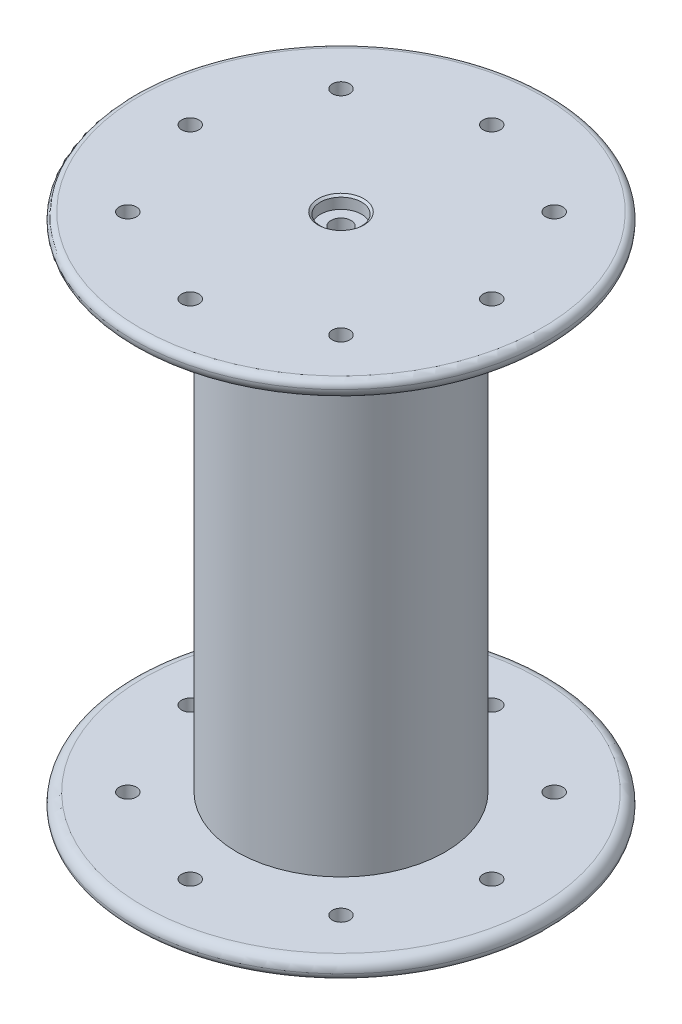
ISO-10303-21;
HEADER;
FILE_DESCRIPTION(('STEP AP214'),'2;1');
FILE_NAME('part.step','',(''),(''),'','','');
FILE_SCHEMA(('AUTOMOTIVE_DESIGN { 1 0 10303 214 1 1 1 1 }'));
ENDSEC;
DATA;
#1=APPLICATION_CONTEXT('core data for automotive mechanical design processes');
#2=APPLICATION_PROTOCOL_DEFINITION('international standard','automotive_design',2000,#1);
#3=PRODUCT_CONTEXT('',#1,'mechanical');
#4=PRODUCT('Part','Part','',(#3));
#5=PRODUCT_RELATED_PRODUCT_CATEGORY('part','',(#4));
#6=PRODUCT_DEFINITION_FORMATION('','',#4);
#7=PRODUCT_DEFINITION_CONTEXT('part definition',#1,'design');
#8=PRODUCT_DEFINITION('design','',#6,#7);
#9=PRODUCT_DEFINITION_SHAPE('','',#8);
#10=(LENGTH_UNIT() NAMED_UNIT(*) SI_UNIT(.MILLI.,.METRE.));
#11=(NAMED_UNIT(*) PLANE_ANGLE_UNIT() SI_UNIT($,.RADIAN.));
#12=(NAMED_UNIT(*) SI_UNIT($,.STERADIAN.) SOLID_ANGLE_UNIT());
#13=UNCERTAINTY_MEASURE_WITH_UNIT(LENGTH_MEASURE(1.E-05),#10,'distance_accuracy_value','');
#14=(GEOMETRIC_REPRESENTATION_CONTEXT(3) GLOBAL_UNCERTAINTY_ASSIGNED_CONTEXT((#13)) GLOBAL_UNIT_ASSIGNED_CONTEXT((#10,
#11,#12)) REPRESENTATION_CONTEXT('',''));
#15=CARTESIAN_POINT('',(0.,0.,0.));
#16=DIRECTION('',(0.,0.,1.));
#17=DIRECTION('',(1.,0.,0.));
#18=AXIS2_PLACEMENT_3D('',#15,#16,#17);
#19=CARTESIAN_POINT('',(0.,70.,0.));
#20=DIRECTION('',(0.,-1.,0.));
#21=DIRECTION('',(0.,0.,-1.));
#22=AXIS2_PLACEMENT_3D('',#19,#20,#21);
#23=CYLINDRICAL_SURFACE('',#22,30.);
#24=CARTESIAN_POINT('',(0.,70.,0.));
#25=DIRECTION('',(0.,1.,0.));
#26=DIRECTION('',(0.,0.,1.));
#27=AXIS2_PLACEMENT_3D('',#24,#25,#26);
#28=CIRCLE('',#27,30.);
#29=CARTESIAN_POINT('',(0.,70.,30.));
#30=VERTEX_POINT('',#29);
#31=EDGE_CURVE('E104',#30,#30,#28,.T.);
#32=ORIENTED_EDGE('',*,*,#31,.F.);
#33=EDGE_LOOP('',(#32));
#34=FACE_BOUND('',#33,.T.);
#35=CARTESIAN_POINT('',(0.,-70.,0.));
#36=DIRECTION('',(0.,1.,0.));
#37=DIRECTION('',(0.,0.,1.));
#38=AXIS2_PLACEMENT_3D('',#35,#36,#37);
#39=CIRCLE('',#38,30.);
#40=CARTESIAN_POINT('',(0.,-70.,30.));
#41=VERTEX_POINT('',#40);
#42=EDGE_CURVE('E105',#41,#41,#39,.T.);
#43=ORIENTED_EDGE('',*,*,#42,.T.);
#44=EDGE_LOOP('',(#43));
#45=FACE_BOUND('',#44,.T.);
#46=ADVANCED_FACE('F37',(#34,#45),#23,.T.);
#47=CARTESIAN_POINT('',(0.,75.,0.));
#48=DIRECTION('',(0.,1.,0.));
#49=DIRECTION('',(0.,0.,1.));
#50=AXIS2_PLACEMENT_3D('',#47,#48,#49);
#51=PLANE('',#50);
#52=CARTESIAN_POINT('',(43.5,75.,1.51879438239676E-13));
#53=DIRECTION('',(0.,1.,0.));
#54=DIRECTION('',(-1.,0.,0.));
#55=AXIS2_PLACEMENT_3D('',#52,#53,#54);
#56=CIRCLE('',#55,2.5);
#57=CARTESIAN_POINT('',(41.,75.,1.43150734892568E-13));
#58=VERTEX_POINT('',#57);
#59=EDGE_CURVE('E135',#58,#58,#56,.T.);
#60=ORIENTED_EDGE('',*,*,#59,.F.);
#61=EDGE_LOOP('',(#60));
#62=FACE_BOUND('',#61,.T.);
#63=CARTESIAN_POINT('',(30.7591449816147,75.,30.759144981615));
#64=DIRECTION('',(0.,1.,0.));
#65=DIRECTION('',(-0.707106781186544,0.,-0.707106781186551));
#66=AXIS2_PLACEMENT_3D('',#63,#64,#65);
#67=CIRCLE('',#66,2.5);
#68=CARTESIAN_POINT('',(28.9913780286483,75.,28.9913780286486));
#69=VERTEX_POINT('',#68);
#70=EDGE_CURVE('E145',#69,#69,#67,.T.);
#71=ORIENTED_EDGE('',*,*,#70,.F.);
#72=EDGE_LOOP('',(#71));
#73=FACE_BOUND('',#72,.T.);
#74=CARTESIAN_POINT('',(0.,75.,43.5));
#75=DIRECTION('',(0.,1.,0.));
#76=DIRECTION('',(0.,0.,-1.));
#77=AXIS2_PLACEMENT_3D('',#74,#75,#76);
#78=CIRCLE('',#77,2.5);
#79=CARTESIAN_POINT('',(0.,75.,41.));
#80=VERTEX_POINT('',#79);
#81=EDGE_CURVE('E140',#80,#80,#78,.T.);
#82=ORIENTED_EDGE('',*,*,#81,.F.);
#83=EDGE_LOOP('',(#82));
#84=FACE_BOUND('',#83,.T.);
#85=CARTESIAN_POINT('',(-30.7591449816151,75.,30.7591449816145));
#86=DIRECTION('',(0.,1.,0.));
#87=DIRECTION('',(0.707106781186554,0.,-0.707106781186541));
#88=AXIS2_PLACEMENT_3D('',#85,#86,#87);
#89=CIRCLE('',#88,2.5);
#90=CARTESIAN_POINT('',(-28.9913780286487,75.,28.9913780286482));
#91=VERTEX_POINT('',#90);
#92=EDGE_CURVE('E136',#91,#91,#89,.T.);
#93=ORIENTED_EDGE('',*,*,#92,.F.);
#94=EDGE_LOOP('',(#93));
#95=FACE_BOUND('',#94,.T.);
#96=CARTESIAN_POINT('',(-43.5,75.,-4.55638314719029E-13));
#97=DIRECTION('',(0.,1.,0.));
#98=DIRECTION('',(1.,0.,0.));
#99=AXIS2_PLACEMENT_3D('',#96,#97,#98);
#100=CIRCLE('',#99,2.5);
#101=CARTESIAN_POINT('',(-41.,75.,-4.29452204677705E-13));
#102=VERTEX_POINT('',#101);
#103=EDGE_CURVE('E141',#102,#102,#100,.T.);
#104=ORIENTED_EDGE('',*,*,#103,.F.);
#105=EDGE_LOOP('',(#104));
#106=FACE_BOUND('',#105,.T.);
#107=CARTESIAN_POINT('',(-30.7591449816144,75.,-30.7591449816152));
#108=DIRECTION('',(0.,1.,0.));
#109=DIRECTION('',(0.707106781186539,0.,0.707106781186556));
#110=AXIS2_PLACEMENT_3D('',#107,#108,#109);
#111=CIRCLE('',#110,2.5);
#112=CARTESIAN_POINT('',(-28.9913780286481,75.,-28.9913780286488));
#113=VERTEX_POINT('',#112);
#114=EDGE_CURVE('E109',#113,#113,#111,.T.);
#115=ORIENTED_EDGE('',*,*,#114,.F.);
#116=EDGE_LOOP('',(#115));
#117=FACE_BOUND('',#116,.T.);
#118=CARTESIAN_POINT('',(30.7591449816149,75.,-30.7591449816148));
#119=DIRECTION('',(0.,1.,0.));
#120=DIRECTION('',(-0.707106781186549,0.,0.707106781186546));
#121=AXIS2_PLACEMENT_3D('',#118,#119,#120);
#122=CIRCLE('',#121,2.5);
#123=CARTESIAN_POINT('',(28.9913780286485,75.,-28.9913780286484));
#124=VERTEX_POINT('',#123);
#125=EDGE_CURVE('E87',#124,#124,#122,.T.);
#126=ORIENTED_EDGE('',*,*,#125,.F.);
#127=EDGE_LOOP('',(#126));
#128=FACE_BOUND('',#127,.T.);
#129=CARTESIAN_POINT('',(0.,75.,-43.5));
#130=DIRECTION('',(0.,1.,0.));
#131=DIRECTION('',(0.,0.,1.));
#132=AXIS2_PLACEMENT_3D('',#129,#130,#131);
#133=CIRCLE('',#132,2.5);
#134=CARTESIAN_POINT('',(0.,75.,-41.));
#135=VERTEX_POINT('',#134);
#136=EDGE_CURVE('E62',#135,#135,#133,.T.);
#137=ORIENTED_EDGE('',*,*,#136,.F.);
#138=EDGE_LOOP('',(#137));
#139=FACE_BOUND('',#138,.T.);
#140=CARTESIAN_POINT('',(0.,75.,0.));
#141=DIRECTION('',(0.,1.,0.));
#142=DIRECTION('',(0.,0.,1.));
#143=AXIS2_PLACEMENT_3D('',#140,#141,#142);
#144=CIRCLE('',#143,6.58876);
#145=CARTESIAN_POINT('',(0.,75.,6.58876));
#146=VERTEX_POINT('',#145);
#147=EDGE_CURVE('E92',#146,#146,#144,.T.);
#148=ORIENTED_EDGE('',*,*,#147,.F.);
#149=EDGE_LOOP('',(#148));
#150=FACE_BOUND('',#149,.T.);
#151=CARTESIAN_POINT('',(0.,75.,0.));
#152=DIRECTION('',(0.,1.,0.));
#153=DIRECTION('',(0.,0.,1.));
#154=AXIS2_PLACEMENT_3D('',#151,#152,#153);
#155=CIRCLE('',#154,58.);
#156=CARTESIAN_POINT('',(0.,75.,58.));
#157=VERTEX_POINT('',#156);
#158=EDGE_CURVE('E100',#157,#157,#155,.T.);
#159=ORIENTED_EDGE('',*,*,#158,.T.);
#160=EDGE_LOOP('',(#159));
#161=FACE_BOUND('',#160,.T.);
#162=ADVANCED_FACE('F270',(#62,#73,#84,#95,#106,#117,#128,#139,#150,#161),#51,.T.);
#163=CARTESIAN_POINT('',(0.,70.,0.));
#164=DIRECTION('',(0.,1.,0.));
#165=DIRECTION('',(0.,0.,1.));
#166=AXIS2_PLACEMENT_3D('',#163,#164,#165);
#167=PLANE('',#166);
#168=CARTESIAN_POINT('',(43.5,70.,1.51879438239676E-13));
#169=DIRECTION('',(0.,1.,0.));
#170=DIRECTION('',(0.,0.,1.));
#171=AXIS2_PLACEMENT_3D('',#168,#169,#170);
#172=CIRCLE('',#171,2.5);
#173=CARTESIAN_POINT('',(43.5,70.,2.50000000000015));
#174=VERTEX_POINT('',#173);
#175=EDGE_CURVE('E58',#174,#174,#172,.T.);
#176=ORIENTED_EDGE('',*,*,#175,.T.);
#177=EDGE_LOOP('',(#176));
#178=FACE_BOUND('',#177,.T.);
#179=CARTESIAN_POINT('',(30.7591449816147,70.,30.759144981615));
#180=DIRECTION('',(0.,1.,0.));
#181=DIRECTION('',(0.,0.,1.));
#182=AXIS2_PLACEMENT_3D('',#179,#180,#181);
#183=CIRCLE('',#182,2.5);
#184=CARTESIAN_POINT('',(30.7591449816147,70.,33.259144981615));
#185=VERTEX_POINT('',#184);
#186=EDGE_CURVE('E63',#185,#185,#183,.T.);
#187=ORIENTED_EDGE('',*,*,#186,.T.);
#188=EDGE_LOOP('',(#187));
#189=FACE_BOUND('',#188,.T.);
#190=CARTESIAN_POINT('',(0.,70.,43.5));
#191=DIRECTION('',(0.,1.,0.));
#192=DIRECTION('',(0.,0.,1.));
#193=AXIS2_PLACEMENT_3D('',#190,#191,#192);
#194=CIRCLE('',#193,2.5);
#195=CARTESIAN_POINT('',(0.,70.,46.));
#196=VERTEX_POINT('',#195);
#197=EDGE_CURVE('E67',#196,#196,#194,.T.);
#198=ORIENTED_EDGE('',*,*,#197,.T.);
#199=EDGE_LOOP('',(#198));
#200=FACE_BOUND('',#199,.T.);
#201=CARTESIAN_POINT('',(-30.7591449816151,70.,30.7591449816145));
#202=DIRECTION('',(0.,1.,0.));
#203=DIRECTION('',(0.,0.,1.));
#204=AXIS2_PLACEMENT_3D('',#201,#202,#203);
#205=CIRCLE('',#204,2.5);
#206=CARTESIAN_POINT('',(-30.7591449816151,70.,33.2591449816145));
#207=VERTEX_POINT('',#206);
#208=EDGE_CURVE('E71',#207,#207,#205,.T.);
#209=ORIENTED_EDGE('',*,*,#208,.T.);
#210=EDGE_LOOP('',(#209));
#211=FACE_BOUND('',#210,.T.);
#212=CARTESIAN_POINT('',(-43.5,70.,-4.55638314719029E-13));
#213=DIRECTION('',(0.,1.,0.));
#214=DIRECTION('',(0.,0.,1.));
#215=AXIS2_PLACEMENT_3D('',#212,#213,#214);
#216=CIRCLE('',#215,2.5);
#217=CARTESIAN_POINT('',(-43.5,70.,2.49999999999955));
#218=VERTEX_POINT('',#217);
#219=EDGE_CURVE('E75',#218,#218,#216,.T.);
#220=ORIENTED_EDGE('',*,*,#219,.T.);
#221=EDGE_LOOP('',(#220));
#222=FACE_BOUND('',#221,.T.);
#223=CARTESIAN_POINT('',(-30.7591449816144,70.,-30.7591449816152));
#224=DIRECTION('',(0.,1.,0.));
#225=DIRECTION('',(0.,0.,1.));
#226=AXIS2_PLACEMENT_3D('',#223,#224,#225);
#227=CIRCLE('',#226,2.5);
#228=CARTESIAN_POINT('',(-30.7591449816144,70.,-28.2591449816152));
#229=VERTEX_POINT('',#228);
#230=EDGE_CURVE('E79',#229,#229,#227,.T.);
#231=ORIENTED_EDGE('',*,*,#230,.T.);
#232=EDGE_LOOP('',(#231));
#233=FACE_BOUND('',#232,.T.);
#234=CARTESIAN_POINT('',(30.7591449816149,70.,-30.7591449816148));
#235=DIRECTION('',(0.,1.,0.));
#236=DIRECTION('',(0.,0.,1.));
#237=AXIS2_PLACEMENT_3D('',#234,#235,#236);
#238=CIRCLE('',#237,2.5);
#239=CARTESIAN_POINT('',(30.7591449816149,70.,-28.2591449816148));
#240=VERTEX_POINT('',#239);
#241=EDGE_CURVE('E83',#240,#240,#238,.T.);
#242=ORIENTED_EDGE('',*,*,#241,.T.);
#243=EDGE_LOOP('',(#242));
#244=FACE_BOUND('',#243,.T.);
#245=CARTESIAN_POINT('',(0.,70.,-43.5));
#246=DIRECTION('',(0.,1.,0.));
#247=DIRECTION('',(0.,0.,1.));
#248=AXIS2_PLACEMENT_3D('',#245,#246,#247);
#249=CIRCLE('',#248,2.5);
#250=CARTESIAN_POINT('',(0.,70.,-41.));
#251=VERTEX_POINT('',#250);
#252=EDGE_CURVE('E88',#251,#251,#249,.T.);
#253=ORIENTED_EDGE('',*,*,#252,.T.);
#254=EDGE_LOOP('',(#253));
#255=FACE_BOUND('',#254,.T.);
#256=CARTESIAN_POINT('',(0.,70.,0.));
#257=DIRECTION('',(0.,1.,0.));
#258=DIRECTION('',(0.,0.,1.));
#259=AXIS2_PLACEMENT_3D('',#256,#257,#258);
#260=CIRCLE('',#259,57.);
#261=CARTESIAN_POINT('',(0.,70.,57.));
#262=VERTEX_POINT('',#261);
#263=EDGE_CURVE('E55',#262,#262,#260,.F.);
#264=ORIENTED_EDGE('',*,*,#263,.T.);
#265=EDGE_LOOP('',(#264));
#266=FACE_BOUND('',#265,.T.);
#267=ORIENTED_EDGE('',*,*,#31,.T.);
#268=EDGE_LOOP('',(#267));
#269=FACE_BOUND('',#268,.T.);
#270=ADVANCED_FACE('F276',(#178,#189,#200,#211,#222,#233,#244,#255,#266,#269),#167,.F.);
#271=CARTESIAN_POINT('',(0.,73.,0.));
#272=DIRECTION('',(0.,1.,0.));
#273=DIRECTION('',(0.,0.,1.));
#274=AXIS2_PLACEMENT_3D('',#271,#272,#273);
#275=TOROIDAL_SURFACE('',#274,58.,2.);
#276=CARTESIAN_POINT('',(0.,73.,0.));
#277=DIRECTION('',(0.,1.,0.));
#278=DIRECTION('',(0.,0.,1.));
#279=AXIS2_PLACEMENT_3D('',#276,#277,#278);
#280=CIRCLE('',#279,60.);
#281=CARTESIAN_POINT('',(0.,73.,60.));
#282=VERTEX_POINT('',#281);
#283=EDGE_CURVE('E96',#282,#282,#280,.F.);
#284=ORIENTED_EDGE('',*,*,#283,.F.);
#285=EDGE_LOOP('',(#284));
#286=FACE_BOUND('',#285,.T.);
#287=ORIENTED_EDGE('',*,*,#158,.F.);
#288=EDGE_LOOP('',(#287));
#289=FACE_BOUND('',#288,.T.);
#290=ADVANCED_FACE('F282',(#286,#289),#275,.T.);
#291=CARTESIAN_POINT('',(0.,73.,0.));
#292=DIRECTION('',(0.,1.,0.));
#293=DIRECTION('',(0.,0.,1.));
#294=AXIS2_PLACEMENT_3D('',#291,#292,#293);
#295=TOROIDAL_SURFACE('',#294,57.,3.);
#296=ORIENTED_EDGE('',*,*,#263,.F.);
#297=EDGE_LOOP('',(#296));
#298=FACE_BOUND('',#297,.T.);
#299=ORIENTED_EDGE('',*,*,#283,.T.);
#300=EDGE_LOOP('',(#299));
#301=FACE_BOUND('',#300,.T.);
#302=ADVANCED_FACE('F285',(#298,#301),#295,.T.);
#303=CARTESIAN_POINT('',(0.,75.,0.));
#304=DIRECTION('',(0.,1.,0.));
#305=DIRECTION('',(0.,0.,1.));
#306=AXIS2_PLACEMENT_3D('',#303,#304,#305);
#307=CYLINDRICAL_SURFACE('',#306,2.89559999999998);
#308=CARTESIAN_POINT('',(0.,71.4186,0.));
#309=DIRECTION('',(0.,1.,0.));
#310=DIRECTION('',(0.,0.,1.));
#311=AXIS2_PLACEMENT_3D('',#308,#309,#310);
#312=CIRCLE('',#311,2.8956);
#313=CARTESIAN_POINT('',(0.,71.4186,2.8956));
#314=VERTEX_POINT('',#313);
#315=EDGE_CURVE('E114',#314,#314,#312,.T.);
#316=ORIENTED_EDGE('',*,*,#315,.T.);
#317=EDGE_LOOP('',(#316));
#318=FACE_BOUND('',#317,.T.);
#319=CARTESIAN_POINT('',(0.,-71.4186,0.));
#320=DIRECTION('',(0.,-1.,0.));
#321=DIRECTION('',(0.,0.,-1.));
#322=AXIS2_PLACEMENT_3D('',#319,#320,#321);
#323=CIRCLE('',#322,2.8956);
#324=CARTESIAN_POINT('',(0.,-71.4186,-2.8956));
#325=VERTEX_POINT('',#324);
#326=EDGE_CURVE('E110',#325,#325,#323,.T.);
#327=ORIENTED_EDGE('',*,*,#326,.T.);
#328=EDGE_LOOP('',(#327));
#329=FACE_BOUND('',#328,.T.);
#330=ADVANCED_FACE('F288',(#318,#329),#307,.F.);
#331=CARTESIAN_POINT('',(5.95376,71.4186,0.));
#332=DIRECTION('',(0.,-1.,0.));
#333=DIRECTION('',(0.,0.,-1.));
#334=AXIS2_PLACEMENT_3D('',#331,#332,#333);
#335=PLANE('',#334);
#336=ORIENTED_EDGE('',*,*,#315,.F.);
#337=EDGE_LOOP('',(#336));
#338=FACE_BOUND('',#337,.T.);
#339=CARTESIAN_POINT('',(0.,71.4186,0.));
#340=DIRECTION('',(0.,1.,0.));
#341=DIRECTION('',(0.,0.,1.));
#342=AXIS2_PLACEMENT_3D('',#339,#340,#341);
#343=CIRCLE('',#342,5.95376);
#344=CARTESIAN_POINT('',(0.,71.4186,5.95376));
#345=VERTEX_POINT('',#344);
#346=EDGE_CURVE('E118',#345,#345,#343,.T.);
#347=ORIENTED_EDGE('',*,*,#346,.T.);
#348=EDGE_LOOP('',(#347));
#349=FACE_BOUND('',#348,.T.);
#350=ADVANCED_FACE('F346',(#338,#349),#335,.F.);
#351=CARTESIAN_POINT('',(0.,75.,0.));
#352=DIRECTION('',(0.,1.,0.));
#353=DIRECTION('',(0.,0.,1.));
#354=AXIS2_PLACEMENT_3D('',#351,#352,#353);
#355=CYLINDRICAL_SURFACE('',#354,5.95376);
#356=ORIENTED_EDGE('',*,*,#346,.F.);
#357=EDGE_LOOP('',(#356));
#358=FACE_BOUND('',#357,.T.);
#359=CARTESIAN_POINT('',(0.,74.4671717342024,0.));
#360=DIRECTION('',(0.,1.,0.));
#361=DIRECTION('',(0.,0.,1.));
#362=AXIS2_PLACEMENT_3D('',#359,#360,#361);
#363=CIRCLE('',#362,5.95376);
#364=CARTESIAN_POINT('',(0.,74.4671717342024,5.95376));
#365=VERTEX_POINT('',#364);
#366=EDGE_CURVE('E122',#365,#365,#363,.T.);
#367=ORIENTED_EDGE('',*,*,#366,.T.);
#368=EDGE_LOOP('',(#367));
#369=FACE_BOUND('',#368,.T.);
#370=ADVANCED_FACE('F342',(#358,#369),#355,.F.);
#371=CARTESIAN_POINT('',(0.,75.,0.));
#372=DIRECTION('',(0.,1.,0.));
#373=DIRECTION('',(0.,0.,1.));
#374=AXIS2_PLACEMENT_3D('',#371,#372,#373);
#375=CONICAL_SURFACE('',#374,6.58876,0.872664625997161);
#376=ORIENTED_EDGE('',*,*,#366,.F.);
#377=EDGE_LOOP('',(#376));
#378=FACE_BOUND('',#377,.T.);
#379=ORIENTED_EDGE('',*,*,#147,.T.);
#380=EDGE_LOOP('',(#379));
#381=FACE_BOUND('',#380,.T.);
#382=ADVANCED_FACE('F338',(#378,#381),#375,.F.);
#383=CARTESIAN_POINT('',(0.,-70.,-43.5));
#384=DIRECTION('',(0.,1.,0.));
#385=DIRECTION('',(0.,0.,1.));
#386=AXIS2_PLACEMENT_3D('',#383,#384,#385);
#387=CYLINDRICAL_SURFACE('',#386,2.5);
#388=ORIENTED_EDGE('',*,*,#136,.T.);
#389=EDGE_LOOP('',(#388));
#390=FACE_BOUND('',#389,.T.);
#391=ORIENTED_EDGE('',*,*,#252,.F.);
#392=EDGE_LOOP('',(#391));
#393=FACE_BOUND('',#392,.T.);
#394=ADVANCED_FACE('F334',(#390,#393),#387,.F.);
#395=CARTESIAN_POINT('',(30.7591449816149,-70.,-30.7591449816148));
#396=DIRECTION('',(0.,1.,0.));
#397=DIRECTION('',(0.,0.,1.));
#398=AXIS2_PLACEMENT_3D('',#395,#396,#397);
#399=CYLINDRICAL_SURFACE('',#398,2.5);
#400=ORIENTED_EDGE('',*,*,#125,.T.);
#401=EDGE_LOOP('',(#400));
#402=FACE_BOUND('',#401,.T.);
#403=ORIENTED_EDGE('',*,*,#241,.F.);
#404=EDGE_LOOP('',(#403));
#405=FACE_BOUND('',#404,.T.);
#406=ADVANCED_FACE('F316',(#402,#405),#399,.F.);
#407=CARTESIAN_POINT('',(-30.7591449816144,-70.,-30.7591449816152));
#408=DIRECTION('',(0.,1.,0.));
#409=DIRECTION('',(0.,0.,1.));
#410=AXIS2_PLACEMENT_3D('',#407,#408,#409);
#411=CYLINDRICAL_SURFACE('',#410,2.5);
#412=ORIENTED_EDGE('',*,*,#114,.T.);
#413=EDGE_LOOP('',(#412));
#414=FACE_BOUND('',#413,.T.);
#415=ORIENTED_EDGE('',*,*,#230,.F.);
#416=EDGE_LOOP('',(#415));
#417=FACE_BOUND('',#416,.T.);
#418=ADVANCED_FACE('F312',(#414,#417),#411,.F.);
#419=CARTESIAN_POINT('',(-43.5,-70.,-4.55638314719029E-13));
#420=DIRECTION('',(0.,1.,0.));
#421=DIRECTION('',(0.,0.,1.));
#422=AXIS2_PLACEMENT_3D('',#419,#420,#421);
#423=CYLINDRICAL_SURFACE('',#422,2.5);
#424=ORIENTED_EDGE('',*,*,#103,.T.);
#425=EDGE_LOOP('',(#424));
#426=FACE_BOUND('',#425,.T.);
#427=ORIENTED_EDGE('',*,*,#219,.F.);
#428=EDGE_LOOP('',(#427));
#429=FACE_BOUND('',#428,.T.);
#430=ADVANCED_FACE('F308',(#426,#429),#423,.F.);
#431=CARTESIAN_POINT('',(-30.7591449816151,-70.,30.7591449816145));
#432=DIRECTION('',(0.,1.,0.));
#433=DIRECTION('',(0.,0.,1.));
#434=AXIS2_PLACEMENT_3D('',#431,#432,#433);
#435=CYLINDRICAL_SURFACE('',#434,2.5);
#436=ORIENTED_EDGE('',*,*,#92,.T.);
#437=EDGE_LOOP('',(#436));
#438=FACE_BOUND('',#437,.T.);
#439=ORIENTED_EDGE('',*,*,#208,.F.);
#440=EDGE_LOOP('',(#439));
#441=FACE_BOUND('',#440,.T.);
#442=ADVANCED_FACE('F311',(#438,#441),#435,.F.);
#443=CARTESIAN_POINT('',(0.,-70.,43.5));
#444=DIRECTION('',(0.,1.,0.));
#445=DIRECTION('',(0.,0.,1.));
#446=AXIS2_PLACEMENT_3D('',#443,#444,#445);
#447=CYLINDRICAL_SURFACE('',#446,2.5);
#448=ORIENTED_EDGE('',*,*,#81,.T.);
#449=EDGE_LOOP('',(#448));
#450=FACE_BOUND('',#449,.T.);
#451=ORIENTED_EDGE('',*,*,#197,.F.);
#452=EDGE_LOOP('',(#451));
#453=FACE_BOUND('',#452,.T.);
#454=ADVANCED_FACE('F324',(#450,#453),#447,.F.);
#455=CARTESIAN_POINT('',(30.7591449816147,-70.,30.759144981615));
#456=DIRECTION('',(0.,1.,0.));
#457=DIRECTION('',(0.,0.,1.));
#458=AXIS2_PLACEMENT_3D('',#455,#456,#457);
#459=CYLINDRICAL_SURFACE('',#458,2.5);
#460=ORIENTED_EDGE('',*,*,#70,.T.);
#461=EDGE_LOOP('',(#460));
#462=FACE_BOUND('',#461,.T.);
#463=ORIENTED_EDGE('',*,*,#186,.F.);
#464=EDGE_LOOP('',(#463));
#465=FACE_BOUND('',#464,.T.);
#466=ADVANCED_FACE('F320',(#462,#465),#459,.F.);
#467=CARTESIAN_POINT('',(43.5,-70.,1.51879438239676E-13));
#468=DIRECTION('',(0.,1.,0.));
#469=DIRECTION('',(0.,0.,1.));
#470=AXIS2_PLACEMENT_3D('',#467,#468,#469);
#471=CYLINDRICAL_SURFACE('',#470,2.5);
#472=ORIENTED_EDGE('',*,*,#59,.T.);
#473=EDGE_LOOP('',(#472));
#474=FACE_BOUND('',#473,.T.);
#475=ORIENTED_EDGE('',*,*,#175,.F.);
#476=EDGE_LOOP('',(#475));
#477=FACE_BOUND('',#476,.T.);
#478=ADVANCED_FACE('F251',(#474,#477),#471,.F.);
#479=CARTESIAN_POINT('',(0.,-70.,0.));
#480=DIRECTION('',(0.,-1.,0.));
#481=DIRECTION('',(0.,0.,1.));
#482=AXIS2_PLACEMENT_3D('',#479,#480,#481);
#483=PLANE('',#482);
#484=CARTESIAN_POINT('',(30.7591449816149,-70.,-30.7591449816148));
#485=DIRECTION('',(0.,-1.,0.));
#486=DIRECTION('',(0.,0.,-1.));
#487=AXIS2_PLACEMENT_3D('',#484,#485,#486);
#488=CIRCLE('',#487,2.5);
#489=CARTESIAN_POINT('',(30.7591449816149,-70.,-33.2591449816148));
#490=VERTEX_POINT('',#489);
#491=EDGE_CURVE('E181',#490,#490,#488,.F.);
#492=ORIENTED_EDGE('',*,*,#491,.F.);
#493=EDGE_LOOP('',(#492));
#494=FACE_BOUND('',#493,.T.);
#495=CARTESIAN_POINT('',(43.5,-70.,1.51879438239676E-13));
#496=DIRECTION('',(0.,-1.,0.));
#497=DIRECTION('',(0.,0.,-1.));
#498=AXIS2_PLACEMENT_3D('',#495,#496,#497);
#499=CIRCLE('',#498,2.5);
#500=CARTESIAN_POINT('',(43.5,-70.,-2.49999999999985));
#501=VERTEX_POINT('',#500);
#502=EDGE_CURVE('E185',#501,#501,#499,.F.);
#503=ORIENTED_EDGE('',*,*,#502,.F.);
#504=EDGE_LOOP('',(#503));
#505=FACE_BOUND('',#504,.T.);
#506=CARTESIAN_POINT('',(30.7591449816147,-70.,30.759144981615));
#507=DIRECTION('',(0.,-1.,0.));
#508=DIRECTION('',(0.,0.,-1.));
#509=AXIS2_PLACEMENT_3D('',#506,#507,#508);
#510=CIRCLE('',#509,2.5);
#511=CARTESIAN_POINT('',(30.7591449816147,-70.,28.259144981615));
#512=VERTEX_POINT('',#511);
#513=EDGE_CURVE('E189',#512,#512,#510,.F.);
#514=ORIENTED_EDGE('',*,*,#513,.F.);
#515=EDGE_LOOP('',(#514));
#516=FACE_BOUND('',#515,.T.);
#517=CARTESIAN_POINT('',(0.,-70.,43.5));
#518=DIRECTION('',(0.,-1.,0.));
#519=DIRECTION('',(0.,0.,-1.));
#520=AXIS2_PLACEMENT_3D('',#517,#518,#519);
#521=CIRCLE('',#520,2.5);
#522=CARTESIAN_POINT('',(0.,-70.,41.));
#523=VERTEX_POINT('',#522);
#524=EDGE_CURVE('E193',#523,#523,#521,.F.);
#525=ORIENTED_EDGE('',*,*,#524,.F.);
#526=EDGE_LOOP('',(#525));
#527=FACE_BOUND('',#526,.T.);
#528=CARTESIAN_POINT('',(-30.7591449816151,-70.,30.7591449816145));
#529=DIRECTION('',(0.,-1.,0.));
#530=DIRECTION('',(0.,0.,-1.));
#531=AXIS2_PLACEMENT_3D('',#528,#529,#530);
#532=CIRCLE('',#531,2.5);
#533=CARTESIAN_POINT('',(-30.7591449816151,-70.,28.2591449816145));
#534=VERTEX_POINT('',#533);
#535=EDGE_CURVE('E197',#534,#534,#532,.F.);
#536=ORIENTED_EDGE('',*,*,#535,.F.);
#537=EDGE_LOOP('',(#536));
#538=FACE_BOUND('',#537,.T.);
#539=CARTESIAN_POINT('',(-43.5,-70.,-4.55638314719029E-13));
#540=DIRECTION('',(0.,-1.,0.));
#541=DIRECTION('',(0.,0.,-1.));
#542=AXIS2_PLACEMENT_3D('',#539,#540,#541);
#543=CIRCLE('',#542,2.5);
#544=CARTESIAN_POINT('',(-43.5,-70.,-2.50000000000046));
#545=VERTEX_POINT('',#544);
#546=EDGE_CURVE('E201',#545,#545,#543,.F.);
#547=ORIENTED_EDGE('',*,*,#546,.F.);
#548=EDGE_LOOP('',(#547));
#549=FACE_BOUND('',#548,.T.);
#550=CARTESIAN_POINT('',(-30.7591449816144,-70.,-30.7591449816152));
#551=DIRECTION('',(0.,-1.,0.));
#552=DIRECTION('',(0.,0.,-1.));
#553=AXIS2_PLACEMENT_3D('',#550,#551,#552);
#554=CIRCLE('',#553,2.5);
#555=CARTESIAN_POINT('',(-30.7591449816144,-70.,-33.2591449816152));
#556=VERTEX_POINT('',#555);
#557=EDGE_CURVE('E205',#556,#556,#554,.F.);
#558=ORIENTED_EDGE('',*,*,#557,.F.);
#559=EDGE_LOOP('',(#558));
#560=FACE_BOUND('',#559,.T.);
#561=CARTESIAN_POINT('',(0.,-70.,-43.5));
#562=DIRECTION('',(0.,-1.,0.));
#563=DIRECTION('',(0.,0.,-1.));
#564=AXIS2_PLACEMENT_3D('',#561,#562,#563);
#565=CIRCLE('',#564,2.5);
#566=CARTESIAN_POINT('',(0.,-70.,-46.));
#567=VERTEX_POINT('',#566);
#568=EDGE_CURVE('E173',#567,#567,#565,.F.);
#569=ORIENTED_EDGE('',*,*,#568,.F.);
#570=EDGE_LOOP('',(#569));
#571=FACE_BOUND('',#570,.T.);
#572=CARTESIAN_POINT('',(0.,-70.,0.));
#573=DIRECTION('',(0.,-1.,0.));
#574=DIRECTION('',(0.,0.,-1.));
#575=AXIS2_PLACEMENT_3D('',#572,#573,#574);
#576=CIRCLE('',#575,57.);
#577=CARTESIAN_POINT('',(0.,-70.,-57.));
#578=VERTEX_POINT('',#577);
#579=EDGE_CURVE('E10',#578,#578,#576,.F.);
#580=ORIENTED_EDGE('',*,*,#579,.T.);
#581=EDGE_LOOP('',(#580));
#582=FACE_BOUND('',#581,.T.);
#583=ORIENTED_EDGE('',*,*,#42,.F.);
#584=EDGE_LOOP('',(#583));
#585=FACE_BOUND('',#584,.T.);
#586=ADVANCED_FACE('F248',(#494,#505,#516,#527,#538,#549,#560,#571,#582,#585),#483,.F.);
#587=CARTESIAN_POINT('',(0.,-75.,0.));
#588=DIRECTION('',(0.,-1.,0.));
#589=DIRECTION('',(0.,0.,1.));
#590=AXIS2_PLACEMENT_3D('',#587,#588,#589);
#591=PLANE('',#590);
#592=CARTESIAN_POINT('',(30.7591449816149,-75.,-30.7591449816148));
#593=DIRECTION('',(0.,1.,0.));
#594=DIRECTION('',(-0.707106781186549,0.,0.707106781186546));
#595=AXIS2_PLACEMENT_3D('',#592,#593,#594);
#596=CIRCLE('',#595,2.5);
#597=CARTESIAN_POINT('',(28.9913780286485,-75.,-28.9913780286484));
#598=VERTEX_POINT('',#597);
#599=EDGE_CURVE('E209',#598,#598,#596,.T.);
#600=ORIENTED_EDGE('',*,*,#599,.T.);
#601=EDGE_LOOP('',(#600));
#602=FACE_BOUND('',#601,.T.);
#603=CARTESIAN_POINT('',(43.5,-75.,1.51879438239676E-13));
#604=DIRECTION('',(0.,1.,0.));
#605=DIRECTION('',(-1.,0.,0.));
#606=AXIS2_PLACEMENT_3D('',#603,#604,#605);
#607=CIRCLE('',#606,2.5);
#608=CARTESIAN_POINT('',(41.,-75.,1.43150734892568E-13));
#609=VERTEX_POINT('',#608);
#610=EDGE_CURVE('E230',#609,#609,#607,.T.);
#611=ORIENTED_EDGE('',*,*,#610,.T.);
#612=EDGE_LOOP('',(#611));
#613=FACE_BOUND('',#612,.T.);
#614=CARTESIAN_POINT('',(30.7591449816147,-75.,30.759144981615));
#615=DIRECTION('',(0.,1.,0.));
#616=DIRECTION('',(-0.707106781186544,0.,-0.707106781186551));
#617=AXIS2_PLACEMENT_3D('',#614,#615,#616);
#618=CIRCLE('',#617,2.5);
#619=CARTESIAN_POINT('',(28.9913780286483,-75.,28.9913780286486));
#620=VERTEX_POINT('',#619);
#621=EDGE_CURVE('E226',#620,#620,#618,.T.);
#622=ORIENTED_EDGE('',*,*,#621,.T.);
#623=EDGE_LOOP('',(#622));
#624=FACE_BOUND('',#623,.T.);
#625=CARTESIAN_POINT('',(0.,-75.,43.5));
#626=DIRECTION('',(0.,1.,0.));
#627=DIRECTION('',(0.,0.,-1.));
#628=AXIS2_PLACEMENT_3D('',#625,#626,#627);
#629=CIRCLE('',#628,2.5);
#630=CARTESIAN_POINT('',(0.,-75.,41.));
#631=VERTEX_POINT('',#630);
#632=EDGE_CURVE('E222',#631,#631,#629,.T.);
#633=ORIENTED_EDGE('',*,*,#632,.T.);
#634=EDGE_LOOP('',(#633));
#635=FACE_BOUND('',#634,.T.);
#636=CARTESIAN_POINT('',(-30.7591449816151,-75.,30.7591449816145));
#637=DIRECTION('',(0.,1.,0.));
#638=DIRECTION('',(0.707106781186554,0.,-0.707106781186541));
#639=AXIS2_PLACEMENT_3D('',#636,#637,#638);
#640=CIRCLE('',#639,2.5);
#641=CARTESIAN_POINT('',(-28.9913780286487,-75.,28.9913780286482));
#642=VERTEX_POINT('',#641);
#643=EDGE_CURVE('E218',#642,#642,#640,.T.);
#644=ORIENTED_EDGE('',*,*,#643,.T.);
#645=EDGE_LOOP('',(#644));
#646=FACE_BOUND('',#645,.T.);
#647=CARTESIAN_POINT('',(-43.5,-75.,-4.55638314719029E-13));
#648=DIRECTION('',(0.,1.,0.));
#649=DIRECTION('',(1.,0.,0.));
#650=AXIS2_PLACEMENT_3D('',#647,#648,#649);
#651=CIRCLE('',#650,2.5);
#652=CARTESIAN_POINT('',(-41.,-75.,-4.29452204677705E-13));
#653=VERTEX_POINT('',#652);
#654=EDGE_CURVE('E214',#653,#653,#651,.T.);
#655=ORIENTED_EDGE('',*,*,#654,.T.);
#656=EDGE_LOOP('',(#655));
#657=FACE_BOUND('',#656,.T.);
#658=CARTESIAN_POINT('',(-30.7591449816144,-75.,-30.7591449816152));
#659=DIRECTION('',(0.,1.,0.));
#660=DIRECTION('',(0.707106781186539,0.,0.707106781186556));
#661=AXIS2_PLACEMENT_3D('',#658,#659,#660);
#662=CIRCLE('',#661,2.5);
#663=CARTESIAN_POINT('',(-28.9913780286481,-75.,-28.9913780286488));
#664=VERTEX_POINT('',#663);
#665=EDGE_CURVE('E210',#664,#664,#662,.T.);
#666=ORIENTED_EDGE('',*,*,#665,.T.);
#667=EDGE_LOOP('',(#666));
#668=FACE_BOUND('',#667,.T.);
#669=CARTESIAN_POINT('',(0.,-75.,-43.5));
#670=DIRECTION('',(0.,1.,0.));
#671=DIRECTION('',(0.,0.,1.));
#672=AXIS2_PLACEMENT_3D('',#669,#670,#671);
#673=CIRCLE('',#672,2.5);
#674=CARTESIAN_POINT('',(0.,-75.,-41.));
#675=VERTEX_POINT('',#674);
#676=EDGE_CURVE('E177',#675,#675,#673,.T.);
#677=ORIENTED_EDGE('',*,*,#676,.T.);
#678=EDGE_LOOP('',(#677));
#679=FACE_BOUND('',#678,.T.);
#680=CARTESIAN_POINT('',(0.,-75.,0.));
#681=DIRECTION('',(0.,-1.,0.));
#682=DIRECTION('',(0.,0.,-1.));
#683=AXIS2_PLACEMENT_3D('',#680,#681,#682);
#684=CIRCLE('',#683,6.58876);
#685=CARTESIAN_POINT('',(0.,-75.,-6.58876));
#686=VERTEX_POINT('',#685);
#687=EDGE_CURVE('E169',#686,#686,#684,.T.);
#688=ORIENTED_EDGE('',*,*,#687,.F.);
#689=EDGE_LOOP('',(#688));
#690=FACE_BOUND('',#689,.T.);
#691=CARTESIAN_POINT('',(0.,-75.,0.));
#692=DIRECTION('',(0.,-1.,0.));
#693=DIRECTION('',(0.,0.,-1.));
#694=AXIS2_PLACEMENT_3D('',#691,#692,#693);
#695=CIRCLE('',#694,58.);
#696=CARTESIAN_POINT('',(0.,-75.,-58.));
#697=VERTEX_POINT('',#696);
#698=EDGE_CURVE('E45',#697,#697,#695,.T.);
#699=ORIENTED_EDGE('',*,*,#698,.T.);
#700=EDGE_LOOP('',(#699));
#701=FACE_BOUND('',#700,.T.);
#702=ADVANCED_FACE('F238',(#602,#613,#624,#635,#646,#657,#668,#679,#690,#701),#591,.T.);
#703=CARTESIAN_POINT('',(0.,-73.,0.));
#704=DIRECTION('',(0.,-1.,0.));
#705=DIRECTION('',(0.,0.,-1.));
#706=AXIS2_PLACEMENT_3D('',#703,#704,#705);
#707=TOROIDAL_SURFACE('',#706,58.,2.);
#708=ORIENTED_EDGE('',*,*,#698,.F.);
#709=EDGE_LOOP('',(#708));
#710=FACE_BOUND('',#709,.T.);
#711=CARTESIAN_POINT('',(0.,-73.,0.));
#712=DIRECTION('',(0.,-1.,0.));
#713=DIRECTION('',(0.,0.,-1.));
#714=AXIS2_PLACEMENT_3D('',#711,#712,#713);
#715=CIRCLE('',#714,60.);
#716=CARTESIAN_POINT('',(0.,-73.,-60.));
#717=VERTEX_POINT('',#716);
#718=EDGE_CURVE('E50',#717,#717,#715,.F.);
#719=ORIENTED_EDGE('',*,*,#718,.F.);
#720=EDGE_LOOP('',(#719));
#721=FACE_BOUND('',#720,.T.);
#722=ADVANCED_FACE('F290',(#710,#721),#707,.T.);
#723=CARTESIAN_POINT('',(0.,-73.,0.));
#724=DIRECTION('',(0.,-1.,0.));
#725=DIRECTION('',(0.,0.,-1.));
#726=AXIS2_PLACEMENT_3D('',#723,#724,#725);
#727=TOROIDAL_SURFACE('',#726,57.,3.);
#728=ORIENTED_EDGE('',*,*,#718,.T.);
#729=EDGE_LOOP('',(#728));
#730=FACE_BOUND('',#729,.T.);
#731=ORIENTED_EDGE('',*,*,#579,.F.);
#732=EDGE_LOOP('',(#731));
#733=FACE_BOUND('',#732,.T.);
#734=ADVANCED_FACE('F39',(#730,#733),#727,.T.);
#735=CARTESIAN_POINT('',(5.95376,-71.4186,0.));
#736=DIRECTION('',(0.,1.,0.));
#737=DIRECTION('',(0.,0.,1.));
#738=AXIS2_PLACEMENT_3D('',#735,#736,#737);
#739=PLANE('',#738);
#740=ORIENTED_EDGE('',*,*,#326,.F.);
#741=EDGE_LOOP('',(#740));
#742=FACE_BOUND('',#741,.T.);
#743=CARTESIAN_POINT('',(0.,-71.4186,0.));
#744=DIRECTION('',(0.,-1.,0.));
#745=DIRECTION('',(0.,0.,-1.));
#746=AXIS2_PLACEMENT_3D('',#743,#744,#745);
#747=CIRCLE('',#746,5.95376);
#748=CARTESIAN_POINT('',(0.,-71.4186,-5.95376));
#749=VERTEX_POINT('',#748);
#750=EDGE_CURVE('E161',#749,#749,#747,.T.);
#751=ORIENTED_EDGE('',*,*,#750,.T.);
#752=EDGE_LOOP('',(#751));
#753=FACE_BOUND('',#752,.T.);
#754=ADVANCED_FACE('F297',(#742,#753),#739,.F.);
#755=CARTESIAN_POINT('',(0.,-75.,0.));
#756=DIRECTION('',(0.,-1.,0.));
#757=DIRECTION('',(0.,0.,-1.));
#758=AXIS2_PLACEMENT_3D('',#755,#756,#757);
#759=CYLINDRICAL_SURFACE('',#758,5.95376);
#760=ORIENTED_EDGE('',*,*,#750,.F.);
#761=EDGE_LOOP('',(#760));
#762=FACE_BOUND('',#761,.T.);
#763=CARTESIAN_POINT('',(0.,-74.4671717342024,0.));
#764=DIRECTION('',(0.,-1.,0.));
#765=DIRECTION('',(0.,0.,-1.));
#766=AXIS2_PLACEMENT_3D('',#763,#764,#765);
#767=CIRCLE('',#766,5.95376);
#768=CARTESIAN_POINT('',(0.,-74.4671717342024,-5.95376));
#769=VERTEX_POINT('',#768);
#770=EDGE_CURVE('E165',#769,#769,#767,.T.);
#771=ORIENTED_EDGE('',*,*,#770,.T.);
#772=EDGE_LOOP('',(#771));
#773=FACE_BOUND('',#772,.T.);
#774=ADVANCED_FACE('F361',(#762,#773),#759,.F.);
#775=CARTESIAN_POINT('',(0.,-75.,0.));
#776=DIRECTION('',(0.,-1.,0.));
#777=DIRECTION('',(0.,0.,-1.));
#778=AXIS2_PLACEMENT_3D('',#775,#776,#777);
#779=CONICAL_SURFACE('',#778,6.58876,0.872664625997161);
#780=ORIENTED_EDGE('',*,*,#770,.F.);
#781=EDGE_LOOP('',(#780));
#782=FACE_BOUND('',#781,.T.);
#783=ORIENTED_EDGE('',*,*,#687,.T.);
#784=EDGE_LOOP('',(#783));
#785=FACE_BOUND('',#784,.T.);
#786=ADVANCED_FACE('F366',(#782,#785),#779,.F.);
#787=CARTESIAN_POINT('',(0.,75.,-43.5));
#788=DIRECTION('',(0.,-1.,0.));
#789=DIRECTION('',(0.,0.,-1.));
#790=AXIS2_PLACEMENT_3D('',#787,#788,#789);
#791=CYLINDRICAL_SURFACE('',#790,2.5);
#792=ORIENTED_EDGE('',*,*,#676,.F.);
#793=EDGE_LOOP('',(#792));
#794=FACE_BOUND('',#793,.T.);
#795=ORIENTED_EDGE('',*,*,#568,.T.);
#796=EDGE_LOOP('',(#795));
#797=FACE_BOUND('',#796,.T.);
#798=ADVANCED_FACE('F371',(#794,#797),#791,.F.);
#799=CARTESIAN_POINT('',(-30.7591449816144,75.,-30.7591449816152));
#800=DIRECTION('',(0.,-1.,0.));
#801=DIRECTION('',(0.,0.,-1.));
#802=AXIS2_PLACEMENT_3D('',#799,#800,#801);
#803=CYLINDRICAL_SURFACE('',#802,2.5);
#804=ORIENTED_EDGE('',*,*,#665,.F.);
#805=EDGE_LOOP('',(#804));
#806=FACE_BOUND('',#805,.T.);
#807=ORIENTED_EDGE('',*,*,#557,.T.);
#808=EDGE_LOOP('',(#807));
#809=FACE_BOUND('',#808,.T.);
#810=ADVANCED_FACE('F378',(#806,#809),#803,.F.);
#811=CARTESIAN_POINT('',(-43.5,75.,-4.55638314719029E-13));
#812=DIRECTION('',(0.,-1.,0.));
#813=DIRECTION('',(0.,0.,-1.));
#814=AXIS2_PLACEMENT_3D('',#811,#812,#813);
#815=CYLINDRICAL_SURFACE('',#814,2.5);
#816=ORIENTED_EDGE('',*,*,#654,.F.);
#817=EDGE_LOOP('',(#816));
#818=FACE_BOUND('',#817,.T.);
#819=ORIENTED_EDGE('',*,*,#546,.T.);
#820=EDGE_LOOP('',(#819));
#821=FACE_BOUND('',#820,.T.);
#822=ADVANCED_FACE('F384',(#818,#821),#815,.F.);
#823=CARTESIAN_POINT('',(-30.7591449816151,75.,30.7591449816145));
#824=DIRECTION('',(0.,-1.,0.));
#825=DIRECTION('',(0.,0.,-1.));
#826=AXIS2_PLACEMENT_3D('',#823,#824,#825);
#827=CYLINDRICAL_SURFACE('',#826,2.5);
#828=ORIENTED_EDGE('',*,*,#643,.F.);
#829=EDGE_LOOP('',(#828));
#830=FACE_BOUND('',#829,.T.);
#831=ORIENTED_EDGE('',*,*,#535,.T.);
#832=EDGE_LOOP('',(#831));
#833=FACE_BOUND('',#832,.T.);
#834=ADVANCED_FACE('F388',(#830,#833),#827,.F.);
#835=CARTESIAN_POINT('',(0.,75.,43.5));
#836=DIRECTION('',(0.,-1.,0.));
#837=DIRECTION('',(0.,0.,-1.));
#838=AXIS2_PLACEMENT_3D('',#835,#836,#837);
#839=CYLINDRICAL_SURFACE('',#838,2.5);
#840=ORIENTED_EDGE('',*,*,#632,.F.);
#841=EDGE_LOOP('',(#840));
#842=FACE_BOUND('',#841,.T.);
#843=ORIENTED_EDGE('',*,*,#524,.T.);
#844=EDGE_LOOP('',(#843));
#845=FACE_BOUND('',#844,.T.);
#846=ADVANCED_FACE('F392',(#842,#845),#839,.F.);
#847=CARTESIAN_POINT('',(30.7591449816147,75.,30.759144981615));
#848=DIRECTION('',(0.,-1.,0.));
#849=DIRECTION('',(0.,0.,-1.));
#850=AXIS2_PLACEMENT_3D('',#847,#848,#849);
#851=CYLINDRICAL_SURFACE('',#850,2.5);
#852=ORIENTED_EDGE('',*,*,#621,.F.);
#853=EDGE_LOOP('',(#852));
#854=FACE_BOUND('',#853,.T.);
#855=ORIENTED_EDGE('',*,*,#513,.T.);
#856=EDGE_LOOP('',(#855));
#857=FACE_BOUND('',#856,.T.);
#858=ADVANCED_FACE('F396',(#854,#857),#851,.F.);
#859=CARTESIAN_POINT('',(43.5,75.,1.51879438239676E-13));
#860=DIRECTION('',(0.,-1.,0.));
#861=DIRECTION('',(0.,0.,-1.));
#862=AXIS2_PLACEMENT_3D('',#859,#860,#861);
#863=CYLINDRICAL_SURFACE('',#862,2.5);
#864=ORIENTED_EDGE('',*,*,#610,.F.);
#865=EDGE_LOOP('',(#864));
#866=FACE_BOUND('',#865,.T.);
#867=ORIENTED_EDGE('',*,*,#502,.T.);
#868=EDGE_LOOP('',(#867));
#869=FACE_BOUND('',#868,.T.);
#870=ADVANCED_FACE('F244',(#866,#869),#863,.F.);
#871=CARTESIAN_POINT('',(30.7591449816149,75.,-30.7591449816148));
#872=DIRECTION('',(0.,-1.,0.));
#873=DIRECTION('',(0.,0.,-1.));
#874=AXIS2_PLACEMENT_3D('',#871,#872,#873);
#875=CYLINDRICAL_SURFACE('',#874,2.5);
#876=ORIENTED_EDGE('',*,*,#599,.F.);
#877=EDGE_LOOP('',(#876));
#878=FACE_BOUND('',#877,.T.);
#879=ORIENTED_EDGE('',*,*,#491,.T.);
#880=EDGE_LOOP('',(#879));
#881=FACE_BOUND('',#880,.T.);
#882=ADVANCED_FACE('F241',(#878,#881),#875,.F.);
#883=CLOSED_SHELL('',(#46,#162,#270,#290,#302,#330,#350,#370,#382,#394,#406,#418,#430,#442,#454,
#466,#478,#586,#702,#722,#734,#754,#774,#786,#798,#810,#822,#834,#846,#858,#870,#882));
#884=MANIFOLD_SOLID_BREP('B2',#883);
#885=ADVANCED_BREP_SHAPE_REPRESENTATION('',(#18,#884),#14);
#886=SHAPE_DEFINITION_REPRESENTATION(#9,#885);
ENDSEC;
END-ISO-10303-21;
